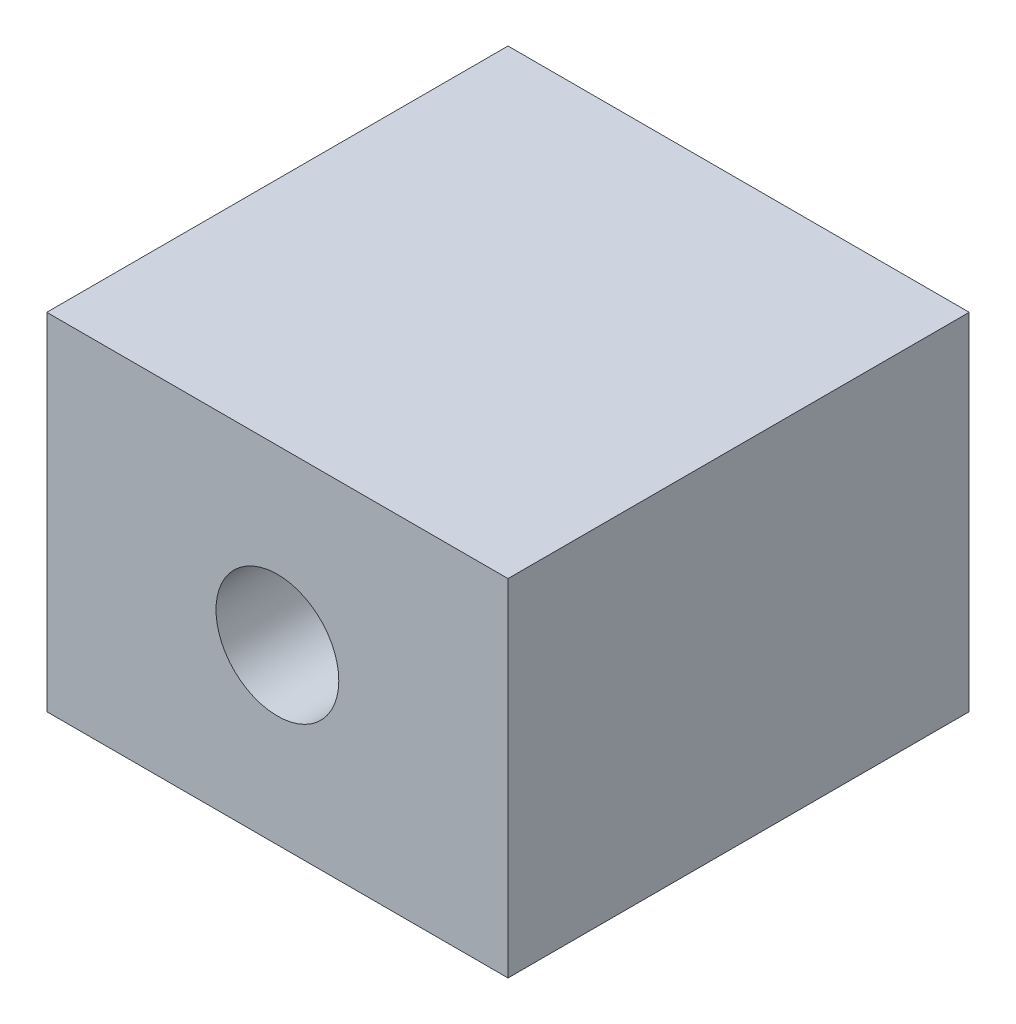
ISO-10303-21;
HEADER;
FILE_DESCRIPTION(('STEP AP214'),'2;1');
FILE_NAME('part.step','',(''),(''),'','','');
FILE_SCHEMA(('AUTOMOTIVE_DESIGN { 1 0 10303 214 1 1 1 1 }'));
ENDSEC;
DATA;
#1=APPLICATION_CONTEXT('core data for automotive mechanical design processes');
#2=APPLICATION_PROTOCOL_DEFINITION('international standard','automotive_design',2000,#1);
#3=PRODUCT_CONTEXT('',#1,'mechanical');
#4=PRODUCT('Part','Part','',(#3));
#5=PRODUCT_RELATED_PRODUCT_CATEGORY('part','',(#4));
#6=PRODUCT_DEFINITION_FORMATION('','',#4);
#7=PRODUCT_DEFINITION_CONTEXT('part definition',#1,'design');
#8=PRODUCT_DEFINITION('design','',#6,#7);
#9=PRODUCT_DEFINITION_SHAPE('','',#8);
#10=(LENGTH_UNIT() NAMED_UNIT(*) SI_UNIT(.MILLI.,.METRE.));
#11=(NAMED_UNIT(*) PLANE_ANGLE_UNIT() SI_UNIT($,.RADIAN.));
#12=(NAMED_UNIT(*) SI_UNIT($,.STERADIAN.) SOLID_ANGLE_UNIT());
#13=UNCERTAINTY_MEASURE_WITH_UNIT(LENGTH_MEASURE(1.E-05),#10,'distance_accuracy_value','');
#14=(GEOMETRIC_REPRESENTATION_CONTEXT(3) GLOBAL_UNCERTAINTY_ASSIGNED_CONTEXT((#13)) GLOBAL_UNIT_ASSIGNED_CONTEXT((#10,
#11,#12)) REPRESENTATION_CONTEXT('',''));
#15=CARTESIAN_POINT('',(0.,0.,0.));
#16=DIRECTION('',(0.,0.,1.));
#17=DIRECTION('',(1.,0.,0.));
#18=AXIS2_PLACEMENT_3D('',#15,#16,#17);
#19=CARTESIAN_POINT('',(0.,7.62,-2.54));
#20=DIRECTION('',(0.,0.,-1.));
#21=DIRECTION('',(-1.,0.,0.));
#22=AXIS2_PLACEMENT_3D('',#19,#20,#21);
#23=PLANE('',#22);
#24=CARTESIAN_POINT('',(18.2736913847895,3.81,-2.54));
#25=DIRECTION('',(0.,0.,-1.));
#26=DIRECTION('',(-1.,0.,0.));
#27=AXIS2_PLACEMENT_3D('',#24,#25,#26);
#28=CIRCLE('',#27,1.35255);
#29=CARTESIAN_POINT('',(16.9211413847895,3.81,-2.54));
#30=VERTEX_POINT('',#29);
#31=EDGE_CURVE('E120',#30,#30,#28,.T.);
#32=ORIENTED_EDGE('',*,*,#31,.F.);
#33=EDGE_LOOP('',(#32));
#34=FACE_BOUND('',#33,.T.);
#35=DIRECTION('',(0.,1.,0.));
#36=VECTOR('',#35,1.);
#37=CARTESIAN_POINT('',(13.1936913847895,7.62,-2.54));
#38=LINE('',#37,#36);
#39=CARTESIAN_POINT('',(13.1936913847895,0.,-2.54));
#40=VERTEX_POINT('',#39);
#41=CARTESIAN_POINT('',(13.1936913847895,7.62,-2.54));
#42=VERTEX_POINT('',#41);
#43=EDGE_CURVE('E60',#40,#42,#38,.T.);
#44=ORIENTED_EDGE('',*,*,#43,.T.);
#45=DIRECTION('',(1.,0.,0.));
#46=VECTOR('',#45,1.);
#47=CARTESIAN_POINT('',(0.,7.62,-2.54));
#48=LINE('',#47,#46);
#49=CARTESIAN_POINT('',(23.3536913847895,7.62,-2.54));
#50=VERTEX_POINT('',#49);
#51=EDGE_CURVE('E68',#42,#50,#48,.T.);
#52=ORIENTED_EDGE('',*,*,#51,.T.);
#53=DIRECTION('',(0.,-1.,0.));
#54=VECTOR('',#53,1.);
#55=CARTESIAN_POINT('',(23.3536913847895,7.62,-2.54));
#56=LINE('',#55,#54);
#57=CARTESIAN_POINT('',(23.3536913847895,0.,-2.54));
#58=VERTEX_POINT('',#57);
#59=EDGE_CURVE('E53',#50,#58,#56,.T.);
#60=ORIENTED_EDGE('',*,*,#59,.T.);
#61=DIRECTION('',(1.,0.,0.));
#62=VECTOR('',#61,1.);
#63=CARTESIAN_POINT('',(0.,0.,-2.54));
#64=LINE('',#63,#62);
#65=EDGE_CURVE('E82',#40,#58,#64,.T.);
#66=ORIENTED_EDGE('',*,*,#65,.F.);
#67=EDGE_LOOP('',(#44,#52,#60,#66));
#68=FACE_BOUND('',#67,.T.);
#69=ADVANCED_FACE('F45',(#34,#68),#23,.T.);
#70=CARTESIAN_POINT('',(0.,7.62,7.62));
#71=DIRECTION('',(0.,0.,-1.));
#72=DIRECTION('',(-1.,0.,0.));
#73=AXIS2_PLACEMENT_3D('',#70,#71,#72);
#74=PLANE('',#73);
#75=CARTESIAN_POINT('',(18.2736913847895,3.81,7.62));
#76=DIRECTION('',(0.,0.,1.));
#77=DIRECTION('',(1.,0.,0.));
#78=AXIS2_PLACEMENT_3D('',#75,#76,#77);
#79=CIRCLE('',#78,1.35255);
#80=CARTESIAN_POINT('',(19.6262413847895,3.81,7.62));
#81=VERTEX_POINT('',#80);
#82=EDGE_CURVE('E126',#81,#81,#79,.T.);
#83=ORIENTED_EDGE('',*,*,#82,.F.);
#84=EDGE_LOOP('',(#83));
#85=FACE_BOUND('',#84,.T.);
#86=DIRECTION('',(1.,0.,0.));
#87=VECTOR('',#86,1.);
#88=CARTESIAN_POINT('',(0.,7.62,7.62));
#89=LINE('',#88,#87);
#90=CARTESIAN_POINT('',(13.1936913847895,7.62,7.62));
#91=VERTEX_POINT('',#90);
#92=CARTESIAN_POINT('',(23.3536913847895,7.62,7.62));
#93=VERTEX_POINT('',#92);
#94=EDGE_CURVE('E103',#91,#93,#89,.T.);
#95=ORIENTED_EDGE('',*,*,#94,.F.);
#96=DIRECTION('',(0.,1.,0.));
#97=VECTOR('',#96,1.);
#98=CARTESIAN_POINT('',(13.1936913847895,7.62,7.62));
#99=LINE('',#98,#97);
#100=CARTESIAN_POINT('',(13.1936913847895,0.,7.62));
#101=VERTEX_POINT('',#100);
#102=EDGE_CURVE('E116',#101,#91,#99,.T.);
#103=ORIENTED_EDGE('',*,*,#102,.F.);
#104=DIRECTION('',(1.,0.,0.));
#105=VECTOR('',#104,1.);
#106=CARTESIAN_POINT('',(0.,0.,7.62));
#107=LINE('',#106,#105);
#108=CARTESIAN_POINT('',(23.3536913847895,0.,7.62));
#109=VERTEX_POINT('',#108);
#110=EDGE_CURVE('E89',#101,#109,#107,.T.);
#111=ORIENTED_EDGE('',*,*,#110,.T.);
#112=DIRECTION('',(0.,-1.,0.));
#113=VECTOR('',#112,1.);
#114=CARTESIAN_POINT('',(23.3536913847895,7.62,7.62));
#115=LINE('',#114,#113);
#116=EDGE_CURVE('E11',#93,#109,#115,.T.);
#117=ORIENTED_EDGE('',*,*,#116,.F.);
#118=EDGE_LOOP('',(#95,#103,#111,#117));
#119=FACE_BOUND('',#118,.T.);
#120=ADVANCED_FACE('F134',(#85,#119),#74,.F.);
#121=CARTESIAN_POINT('',(23.3536913847895,7.62,0.));
#122=DIRECTION('',(-1.,0.,0.));
#123=DIRECTION('',(0.,0.,1.));
#124=AXIS2_PLACEMENT_3D('',#121,#122,#123);
#125=PLANE('',#124);
#126=DIRECTION('',(0.,0.,-1.));
#127=VECTOR('',#126,1.);
#128=CARTESIAN_POINT('',(23.3536913847895,0.,0.));
#129=LINE('',#128,#127);
#130=EDGE_CURVE('E86',#109,#58,#129,.T.);
#131=ORIENTED_EDGE('',*,*,#130,.T.);
#132=ORIENTED_EDGE('',*,*,#59,.F.);
#133=DIRECTION('',(0.,0.,-1.));
#134=VECTOR('',#133,1.);
#135=CARTESIAN_POINT('',(23.3536913847895,7.62,0.));
#136=LINE('',#135,#134);
#137=EDGE_CURVE('E96',#93,#50,#136,.T.);
#138=ORIENTED_EDGE('',*,*,#137,.F.);
#139=ORIENTED_EDGE('',*,*,#116,.T.);
#140=EDGE_LOOP('',(#131,#132,#138,#139));
#141=FACE_BOUND('',#140,.T.);
#142=ADVANCED_FACE('F97',(#141),#125,.F.);
#143=CARTESIAN_POINT('',(0.,7.62,0.));
#144=DIRECTION('',(0.,1.,0.));
#145=DIRECTION('',(0.,0.,1.));
#146=AXIS2_PLACEMENT_3D('',#143,#144,#145);
#147=PLANE('',#146);
#148=DIRECTION('',(0.,0.,1.));
#149=VECTOR('',#148,1.);
#150=CARTESIAN_POINT('',(13.1936913847895,7.62,-2.54));
#151=LINE('',#150,#149);
#152=EDGE_CURVE('E90',#42,#91,#151,.T.);
#153=ORIENTED_EDGE('',*,*,#152,.T.);
#154=ORIENTED_EDGE('',*,*,#94,.T.);
#155=ORIENTED_EDGE('',*,*,#137,.T.);
#156=ORIENTED_EDGE('',*,*,#51,.F.);
#157=EDGE_LOOP('',(#153,#154,#155,#156));
#158=FACE_BOUND('',#157,.T.);
#159=ADVANCED_FACE('F142',(#158),#147,.T.);
#160=CARTESIAN_POINT('',(0.,0.,0.));
#161=DIRECTION('',(0.,1.,0.));
#162=DIRECTION('',(0.,0.,1.));
#163=AXIS2_PLACEMENT_3D('',#160,#161,#162);
#164=PLANE('',#163);
#165=ORIENTED_EDGE('',*,*,#110,.F.);
#166=DIRECTION('',(0.,0.,1.));
#167=VECTOR('',#166,1.);
#168=CARTESIAN_POINT('',(13.1936913847895,0.,-2.54));
#169=LINE('',#168,#167);
#170=EDGE_CURVE('E87',#40,#101,#169,.T.);
#171=ORIENTED_EDGE('',*,*,#170,.F.);
#172=ORIENTED_EDGE('',*,*,#65,.T.);
#173=ORIENTED_EDGE('',*,*,#130,.F.);
#174=EDGE_LOOP('',(#165,#171,#172,#173));
#175=FACE_BOUND('',#174,.T.);
#176=ADVANCED_FACE('F84',(#175),#164,.F.);
#177=CARTESIAN_POINT('',(13.1936913847895,7.62,-2.54));
#178=DIRECTION('',(1.,0.,0.));
#179=DIRECTION('',(0.,1.,0.));
#180=AXIS2_PLACEMENT_3D('',#177,#178,#179);
#181=PLANE('',#180);
#182=ORIENTED_EDGE('',*,*,#102,.T.);
#183=ORIENTED_EDGE('',*,*,#152,.F.);
#184=ORIENTED_EDGE('',*,*,#43,.F.);
#185=ORIENTED_EDGE('',*,*,#170,.T.);
#186=EDGE_LOOP('',(#182,#183,#184,#185));
#187=FACE_BOUND('',#186,.T.);
#188=ADVANCED_FACE('F143',(#187),#181,.F.);
#189=CARTESIAN_POINT('',(18.2736913847895,3.81,7.62));
#190=DIRECTION('',(0.,0.,1.));
#191=DIRECTION('',(1.,0.,0.));
#192=AXIS2_PLACEMENT_3D('',#189,#190,#191);
#193=CYLINDRICAL_SURFACE('',#192,1.35255);
#194=ORIENTED_EDGE('',*,*,#82,.T.);
#195=EDGE_LOOP('',(#194));
#196=FACE_BOUND('',#195,.T.);
#197=ORIENTED_EDGE('',*,*,#31,.T.);
#198=EDGE_LOOP('',(#197));
#199=FACE_BOUND('',#198,.T.);
#200=ADVANCED_FACE('F131',(#196,#199),#193,.F.);
#201=CLOSED_SHELL('',(#69,#120,#142,#159,#176,#188,#200));
#202=MANIFOLD_SOLID_BREP('B2',#201);
#203=ADVANCED_BREP_SHAPE_REPRESENTATION('',(#18,#202),#14);
#204=SHAPE_DEFINITION_REPRESENTATION(#9,#203);
ENDSEC;
END-ISO-10303-21;
